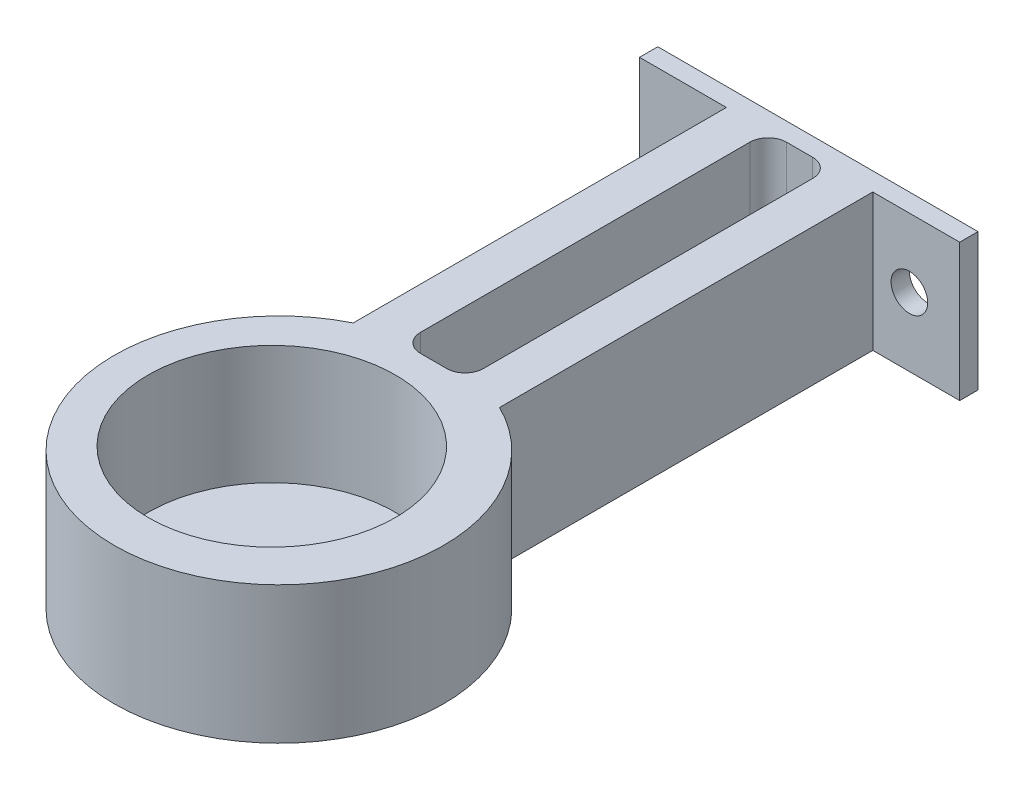
ISO-10303-21;
HEADER;
FILE_DESCRIPTION(('STEP AP214'),'2;1');
FILE_NAME('part.step','',(''),(''),'','','');
FILE_SCHEMA(('AUTOMOTIVE_DESIGN { 1 0 10303 214 1 1 1 1 }'));
ENDSEC;
DATA;
#1=APPLICATION_CONTEXT('core data for automotive mechanical design processes');
#2=APPLICATION_PROTOCOL_DEFINITION('international standard','automotive_design',2000,#1);
#3=PRODUCT_CONTEXT('',#1,'mechanical');
#4=PRODUCT('Part','Part','',(#3));
#5=PRODUCT_RELATED_PRODUCT_CATEGORY('part','',(#4));
#6=PRODUCT_DEFINITION_FORMATION('','',#4);
#7=PRODUCT_DEFINITION_CONTEXT('part definition',#1,'design');
#8=PRODUCT_DEFINITION('design','',#6,#7);
#9=PRODUCT_DEFINITION_SHAPE('','',#8);
#10=(LENGTH_UNIT() NAMED_UNIT(*) SI_UNIT(.MILLI.,.METRE.));
#11=(NAMED_UNIT(*) PLANE_ANGLE_UNIT() SI_UNIT($,.RADIAN.));
#12=(NAMED_UNIT(*) SI_UNIT($,.STERADIAN.) SOLID_ANGLE_UNIT());
#13=UNCERTAINTY_MEASURE_WITH_UNIT(LENGTH_MEASURE(1.E-05),#10,'distance_accuracy_value','');
#14=(GEOMETRIC_REPRESENTATION_CONTEXT(3) GLOBAL_UNCERTAINTY_ASSIGNED_CONTEXT((#13)) GLOBAL_UNIT_ASSIGNED_CONTEXT((#10,
#11,#12)) REPRESENTATION_CONTEXT('',''));
#15=CARTESIAN_POINT('',(0.,0.,0.));
#16=DIRECTION('',(0.,0.,1.));
#17=DIRECTION('',(1.,0.,0.));
#18=AXIS2_PLACEMENT_3D('',#15,#16,#17);
#19=CARTESIAN_POINT('',(6.14884425387227,15.,-16.9172017290574));
#20=DIRECTION('',(0.,0.,1.));
#21=DIRECTION('',(1.,0.,0.));
#22=AXIS2_PLACEMENT_3D('',#19,#20,#21);
#23=PLANE('',#22);
#24=DIRECTION('',(-1.,0.,0.));
#25=VECTOR('',#24,1.);
#26=CARTESIAN_POINT('',(6.14884425387227,15.,-16.9172017290574));
#27=LINE('',#26,#25);
#28=CARTESIAN_POINT('',(1.43477103108826,15.,-16.9172017290574));
#29=VERTEX_POINT('',#28);
#30=CARTESIAN_POINT('',(-1.43477103108824,15.,-16.9172017290574));
#31=VERTEX_POINT('',#30);
#32=EDGE_CURVE('E220',#29,#31,#27,.T.);
#33=ORIENTED_EDGE('',*,*,#32,.F.);
#34=DIRECTION('',(0.,1.,0.));
#35=VECTOR('',#34,1.);
#36=CARTESIAN_POINT('',(1.43477103108826,0.,-16.9172017290574));
#37=LINE('',#36,#35);
#38=CARTESIAN_POINT('',(1.43477103108826,0.,-16.9172017290574));
#39=VERTEX_POINT('',#38);
#40=EDGE_CURVE('E234',#29,#39,#37,.F.);
#41=ORIENTED_EDGE('',*,*,#40,.T.);
#42=DIRECTION('',(-1.,0.,0.));
#43=VECTOR('',#42,1.);
#44=CARTESIAN_POINT('',(6.14884425387227,0.,-16.9172017290574));
#45=LINE('',#44,#43);
#46=CARTESIAN_POINT('',(-1.43477103108824,0.,-16.9172017290574));
#47=VERTEX_POINT('',#46);
#48=EDGE_CURVE('E221',#39,#47,#45,.T.);
#49=ORIENTED_EDGE('',*,*,#48,.T.);
#50=DIRECTION('',(0.,1.,0.));
#51=VECTOR('',#50,1.);
#52=CARTESIAN_POINT('',(-1.43477103108825,15.,-16.9172017290574));
#53=LINE('',#52,#51);
#54=EDGE_CURVE('E231',#47,#31,#53,.T.);
#55=ORIENTED_EDGE('',*,*,#54,.T.);
#56=EDGE_LOOP('',(#33,#41,#49,#55));
#57=FACE_BOUND('',#56,.T.);
#58=ADVANCED_FACE('F39',(#57),#23,.F.);
#59=CARTESIAN_POINT('',(0.,15.,0.));
#60=DIRECTION('',(0.,-1.,0.));
#61=DIRECTION('',(0.,0.,-1.));
#62=AXIS2_PLACEMENT_3D('',#59,#60,#61);
#63=CYLINDRICAL_SURFACE('',#62,18.);
#64=DIRECTION('',(0.,-1.,0.));
#65=VECTOR('',#64,1.);
#66=CARTESIAN_POINT('',(8.,15.,-16.1245154965971));
#67=LINE('',#66,#65);
#68=CARTESIAN_POINT('',(8.,15.,-16.1245154965971));
#69=VERTEX_POINT('',#68);
#70=CARTESIAN_POINT('',(8.,0.,-16.1245154965971));
#71=VERTEX_POINT('',#70);
#72=EDGE_CURVE('E215',#69,#71,#67,.T.);
#73=ORIENTED_EDGE('',*,*,#72,.F.);
#74=CARTESIAN_POINT('',(0.,15.,0.));
#75=DIRECTION('',(0.,1.,0.));
#76=DIRECTION('',(0.,0.,1.));
#77=AXIS2_PLACEMENT_3D('',#74,#75,#76);
#78=CIRCLE('',#77,18.);
#79=CARTESIAN_POINT('',(-8.,15.,-16.1245154965971));
#80=VERTEX_POINT('',#79);
#81=EDGE_CURVE('E218',#80,#69,#78,.T.);
#82=ORIENTED_EDGE('',*,*,#81,.F.);
#83=DIRECTION('',(0.,-1.,0.));
#84=VECTOR('',#83,1.);
#85=CARTESIAN_POINT('',(-8.,15.,-16.1245154965971));
#86=LINE('',#85,#84);
#87=CARTESIAN_POINT('',(-8.,0.,-16.1245154965971));
#88=VERTEX_POINT('',#87);
#89=EDGE_CURVE('E207',#80,#88,#86,.T.);
#90=ORIENTED_EDGE('',*,*,#89,.T.);
#91=CARTESIAN_POINT('',(0.,0.,0.));
#92=DIRECTION('',(0.,1.,0.));
#93=DIRECTION('',(0.,0.,1.));
#94=AXIS2_PLACEMENT_3D('',#91,#92,#93);
#95=CIRCLE('',#94,18.);
#96=EDGE_CURVE('E217',#88,#71,#95,.T.);
#97=ORIENTED_EDGE('',*,*,#96,.T.);
#98=EDGE_LOOP('',(#73,#82,#90,#97));
#99=FACE_BOUND('',#98,.T.);
#100=ADVANCED_FACE('F310',(#99),#63,.T.);
#101=CARTESIAN_POINT('',(0.,15.,0.));
#102=DIRECTION('',(0.,1.,0.));
#103=DIRECTION('',(0.,0.,1.));
#104=AXIS2_PLACEMENT_3D('',#101,#102,#103);
#105=PLANE('',#104);
#106=DIRECTION('',(0.,0.,1.));
#107=VECTOR('',#106,1.);
#108=CARTESIAN_POINT('',(-3.43477103108825,15.,-56.9172017290574));
#109=LINE('',#108,#107);
#110=CARTESIAN_POINT('',(-3.43477103108825,15.,-54.9172017290574));
#111=VERTEX_POINT('',#110);
#112=CARTESIAN_POINT('',(-3.43477103108825,15.,-18.9172017290574));
#113=VERTEX_POINT('',#112);
#114=EDGE_CURVE('E194',#111,#113,#109,.T.);
#115=ORIENTED_EDGE('',*,*,#114,.F.);
#116=CARTESIAN_POINT('',(-1.43477103108825,15.,-54.9172017290574));
#117=DIRECTION('',(0.,1.,0.));
#118=DIRECTION('',(0.,0.,1.));
#119=AXIS2_PLACEMENT_3D('',#116,#117,#118);
#120=CIRCLE('',#119,2.);
#121=CARTESIAN_POINT('',(-1.43477103108825,15.,-56.9172017290574));
#122=VERTEX_POINT('',#121);
#123=EDGE_CURVE('E47',#111,#122,#120,.F.);
#124=ORIENTED_EDGE('',*,*,#123,.T.);
#125=DIRECTION('',(1.,0.,0.));
#126=VECTOR('',#125,1.);
#127=CARTESIAN_POINT('',(0.,15.,-56.9172017290574));
#128=LINE('',#127,#126);
#129=CARTESIAN_POINT('',(1.43477103108826,15.,-56.9172017290574));
#130=VERTEX_POINT('',#129);
#131=EDGE_CURVE('E266',#122,#130,#128,.T.);
#132=ORIENTED_EDGE('',*,*,#131,.T.);
#133=CARTESIAN_POINT('',(1.43477103108826,15.,-54.9172017290574));
#134=DIRECTION('',(0.,1.,0.));
#135=DIRECTION('',(0.,0.,1.));
#136=AXIS2_PLACEMENT_3D('',#133,#134,#135);
#137=CIRCLE('',#136,2.);
#138=CARTESIAN_POINT('',(3.43477103108826,15.,-54.9172017290574));
#139=VERTEX_POINT('',#138);
#140=EDGE_CURVE('E258',#130,#139,#137,.F.);
#141=ORIENTED_EDGE('',*,*,#140,.T.);
#142=DIRECTION('',(0.,0.,1.));
#143=VECTOR('',#142,1.);
#144=CARTESIAN_POINT('',(3.43477103108826,15.,-56.9172017290574));
#145=LINE('',#144,#143);
#146=CARTESIAN_POINT('',(3.43477103108826,15.,-18.9172017290574));
#147=VERTEX_POINT('',#146);
#148=EDGE_CURVE('E182',#139,#147,#145,.T.);
#149=ORIENTED_EDGE('',*,*,#148,.T.);
#150=CARTESIAN_POINT('',(1.43477103108826,15.,-18.9172017290574));
#151=DIRECTION('',(0.,1.,0.));
#152=DIRECTION('',(0.,0.,1.));
#153=AXIS2_PLACEMENT_3D('',#150,#151,#152);
#154=CIRCLE('',#153,2.);
#155=EDGE_CURVE('E239',#147,#29,#154,.F.);
#156=ORIENTED_EDGE('',*,*,#155,.T.);
#157=ORIENTED_EDGE('',*,*,#32,.T.);
#158=CARTESIAN_POINT('',(-1.43477103108825,15.,-18.9172017290574));
#159=DIRECTION('',(0.,1.,0.));
#160=DIRECTION('',(0.,0.,1.));
#161=AXIS2_PLACEMENT_3D('',#158,#159,#160);
#162=CIRCLE('',#161,2.);
#163=EDGE_CURVE('E244',#31,#113,#162,.F.);
#164=ORIENTED_EDGE('',*,*,#163,.T.);
#165=EDGE_LOOP('',(#115,#124,#132,#141,#149,#156,#157,#164));
#166=FACE_BOUND('',#165,.T.);
#167=CARTESIAN_POINT('',(-0.775740082247012,15.,0.));
#168=DIRECTION('',(0.,1.,0.));
#169=DIRECTION('',(0.,0.,1.));
#170=AXIS2_PLACEMENT_3D('',#167,#168,#169);
#171=CIRCLE('',#170,13.51);
#172=CARTESIAN_POINT('',(-0.775740082247012,15.,13.51));
#173=VERTEX_POINT('',#172);
#174=EDGE_CURVE('E198',#173,#173,#171,.T.);
#175=ORIENTED_EDGE('',*,*,#174,.F.);
#176=EDGE_LOOP('',(#175));
#177=FACE_BOUND('',#176,.T.);
#178=ORIENTED_EDGE('',*,*,#81,.T.);
#179=DIRECTION('',(0.,0.,-1.));
#180=VECTOR('',#179,1.);
#181=CARTESIAN_POINT('',(8.,15.,-12.9172017290574));
#182=LINE('',#181,#180);
#183=CARTESIAN_POINT('',(8.,15.,-56.9172017290574));
#184=VERTEX_POINT('',#183);
#185=EDGE_CURVE('E208',#69,#184,#182,.T.);
#186=ORIENTED_EDGE('',*,*,#185,.T.);
#187=CARTESIAN_POINT('',(17.5,15.,-56.9172017290574));
#188=VERTEX_POINT('',#187);
#189=EDGE_CURVE('E272',#184,#188,#128,.T.);
#190=ORIENTED_EDGE('',*,*,#189,.T.);
#191=DIRECTION('',(0.,0.,1.));
#192=VECTOR('',#191,1.);
#193=CARTESIAN_POINT('',(17.5,15.,-58.9172017290574));
#194=LINE('',#193,#192);
#195=CARTESIAN_POINT('',(17.5,15.,-58.9172017290574));
#196=VERTEX_POINT('',#195);
#197=EDGE_CURVE('E160',#196,#188,#194,.T.);
#198=ORIENTED_EDGE('',*,*,#197,.F.);
#199=DIRECTION('',(1.,0.,0.));
#200=VECTOR('',#199,1.);
#201=CARTESIAN_POINT('',(0.,15.,-58.9172017290574));
#202=LINE('',#201,#200);
#203=CARTESIAN_POINT('',(-17.5,15.,-58.9172017290574));
#204=VERTEX_POINT('',#203);
#205=EDGE_CURVE('E151',#204,#196,#202,.T.);
#206=ORIENTED_EDGE('',*,*,#205,.F.);
#207=DIRECTION('',(0.,0.,1.));
#208=VECTOR('',#207,1.);
#209=CARTESIAN_POINT('',(-17.5,15.,-58.9172017290574));
#210=LINE('',#209,#208);
#211=CARTESIAN_POINT('',(-17.5,15.,-56.9172017290574));
#212=VERTEX_POINT('',#211);
#213=EDGE_CURVE('E157',#204,#212,#210,.T.);
#214=ORIENTED_EDGE('',*,*,#213,.T.);
#215=CARTESIAN_POINT('',(-8.,15.,-56.9172017290574));
#216=VERTEX_POINT('',#215);
#217=EDGE_CURVE('E271',#212,#216,#128,.T.);
#218=ORIENTED_EDGE('',*,*,#217,.T.);
#219=DIRECTION('',(0.,0.,-1.));
#220=VECTOR('',#219,1.);
#221=CARTESIAN_POINT('',(-8.,15.,-12.9172017290574));
#222=LINE('',#221,#220);
#223=EDGE_CURVE('E210',#80,#216,#222,.T.);
#224=ORIENTED_EDGE('',*,*,#223,.F.);
#225=EDGE_LOOP('',(#178,#186,#190,#198,#206,#214,#218,#224));
#226=FACE_BOUND('',#225,.T.);
#227=ADVANCED_FACE('F154',(#166,#177,#226),#105,.T.);
#228=CARTESIAN_POINT('',(0.,0.,0.));
#229=DIRECTION('',(0.,1.,0.));
#230=DIRECTION('',(0.,0.,1.));
#231=AXIS2_PLACEMENT_3D('',#228,#229,#230);
#232=PLANE('',#231);
#233=DIRECTION('',(0.,0.,-1.));
#234=VECTOR('',#233,1.);
#235=CARTESIAN_POINT('',(-8.,0.,-12.9172017290574));
#236=LINE('',#235,#234);
#237=CARTESIAN_POINT('',(-8.,0.,-56.9172017290574));
#238=VERTEX_POINT('',#237);
#239=EDGE_CURVE('E202',#88,#238,#236,.T.);
#240=ORIENTED_EDGE('',*,*,#239,.T.);
#241=DIRECTION('',(1.,0.,0.));
#242=VECTOR('',#241,1.);
#243=CARTESIAN_POINT('',(0.,0.,-56.9172017290574));
#244=LINE('',#243,#242);
#245=CARTESIAN_POINT('',(-17.5,0.,-56.9172017290574));
#246=VERTEX_POINT('',#245);
#247=EDGE_CURVE('E362',#246,#238,#244,.T.);
#248=ORIENTED_EDGE('',*,*,#247,.F.);
#249=DIRECTION('',(0.,0.,1.));
#250=VECTOR('',#249,1.);
#251=CARTESIAN_POINT('',(-17.5,0.,-58.9172017290574));
#252=LINE('',#251,#250);
#253=CARTESIAN_POINT('',(-17.5,0.,-58.9172017290574));
#254=VERTEX_POINT('',#253);
#255=EDGE_CURVE('E371',#254,#246,#252,.T.);
#256=ORIENTED_EDGE('',*,*,#255,.F.);
#257=DIRECTION('',(1.,0.,0.));
#258=VECTOR('',#257,1.);
#259=CARTESIAN_POINT('',(0.,0.,-58.9172017290574));
#260=LINE('',#259,#258);
#261=CARTESIAN_POINT('',(17.5,0.,-58.9172017290574));
#262=VERTEX_POINT('',#261);
#263=EDGE_CURVE('E172',#254,#262,#260,.T.);
#264=ORIENTED_EDGE('',*,*,#263,.T.);
#265=DIRECTION('',(0.,0.,1.));
#266=VECTOR('',#265,1.);
#267=CARTESIAN_POINT('',(17.5,0.,-58.9172017290574));
#268=LINE('',#267,#266);
#269=CARTESIAN_POINT('',(17.5,0.,-56.9172017290574));
#270=VERTEX_POINT('',#269);
#271=EDGE_CURVE('E184',#262,#270,#268,.T.);
#272=ORIENTED_EDGE('',*,*,#271,.T.);
#273=CARTESIAN_POINT('',(8.,0.,-56.9172017290574));
#274=VERTEX_POINT('',#273);
#275=EDGE_CURVE('E368',#274,#270,#244,.T.);
#276=ORIENTED_EDGE('',*,*,#275,.F.);
#277=DIRECTION('',(0.,0.,-1.));
#278=VECTOR('',#277,1.);
#279=CARTESIAN_POINT('',(8.,0.,-12.9172017290574));
#280=LINE('',#279,#278);
#281=EDGE_CURVE('E205',#71,#274,#280,.T.);
#282=ORIENTED_EDGE('',*,*,#281,.F.);
#283=ORIENTED_EDGE('',*,*,#96,.F.);
#284=EDGE_LOOP('',(#240,#248,#256,#264,#272,#276,#282,#283));
#285=FACE_BOUND('',#284,.T.);
#286=ORIENTED_EDGE('',*,*,#48,.F.);
#287=CARTESIAN_POINT('',(1.43477103108826,0.,-18.9172017290574));
#288=DIRECTION('',(0.,1.,0.));
#289=DIRECTION('',(0.,0.,1.));
#290=AXIS2_PLACEMENT_3D('',#287,#288,#289);
#291=CIRCLE('',#290,2.);
#292=CARTESIAN_POINT('',(3.43477103108826,0.,-18.9172017290574));
#293=VERTEX_POINT('',#292);
#294=EDGE_CURVE('E241',#39,#293,#291,.T.);
#295=ORIENTED_EDGE('',*,*,#294,.T.);
#296=DIRECTION('',(0.,0.,1.));
#297=VECTOR('',#296,1.);
#298=CARTESIAN_POINT('',(3.43477103108826,0.,-56.9172017290574));
#299=LINE('',#298,#297);
#300=CARTESIAN_POINT('',(3.43477103108826,0.,-54.9172017290574));
#301=VERTEX_POINT('',#300);
#302=EDGE_CURVE('E189',#301,#293,#299,.T.);
#303=ORIENTED_EDGE('',*,*,#302,.F.);
#304=CARTESIAN_POINT('',(1.43477103108826,0.,-54.9172017290574));
#305=DIRECTION('',(0.,1.,0.));
#306=DIRECTION('',(0.,0.,1.));
#307=AXIS2_PLACEMENT_3D('',#304,#305,#306);
#308=CIRCLE('',#307,2.);
#309=CARTESIAN_POINT('',(1.43477103108826,0.,-56.9172017290574));
#310=VERTEX_POINT('',#309);
#311=EDGE_CURVE('E260',#301,#310,#308,.T.);
#312=ORIENTED_EDGE('',*,*,#311,.T.);
#313=CARTESIAN_POINT('',(-1.43477103108825,0.,-56.9172017290574));
#314=VERTEX_POINT('',#313);
#315=EDGE_CURVE('E366',#314,#310,#244,.T.);
#316=ORIENTED_EDGE('',*,*,#315,.F.);
#317=CARTESIAN_POINT('',(-1.43477103108825,0.,-54.9172017290574));
#318=DIRECTION('',(0.,1.,0.));
#319=DIRECTION('',(0.,0.,1.));
#320=AXIS2_PLACEMENT_3D('',#317,#318,#319);
#321=CIRCLE('',#320,2.);
#322=CARTESIAN_POINT('',(-3.43477103108825,0.,-54.9172017290574));
#323=VERTEX_POINT('',#322);
#324=EDGE_CURVE('E11',#314,#323,#321,.T.);
#325=ORIENTED_EDGE('',*,*,#324,.T.);
#326=DIRECTION('',(0.,0.,1.));
#327=VECTOR('',#326,1.);
#328=CARTESIAN_POINT('',(-3.43477103108825,0.,-56.9172017290574));
#329=LINE('',#328,#327);
#330=CARTESIAN_POINT('',(-3.43477103108825,0.,-18.9172017290574));
#331=VERTEX_POINT('',#330);
#332=EDGE_CURVE('E196',#323,#331,#329,.T.);
#333=ORIENTED_EDGE('',*,*,#332,.T.);
#334=CARTESIAN_POINT('',(-1.43477103108825,0.,-18.9172017290574));
#335=DIRECTION('',(0.,1.,0.));
#336=DIRECTION('',(0.,0.,1.));
#337=AXIS2_PLACEMENT_3D('',#334,#335,#336);
#338=CIRCLE('',#337,2.);
#339=EDGE_CURVE('E247',#331,#47,#338,.T.);
#340=ORIENTED_EDGE('',*,*,#339,.T.);
#341=EDGE_LOOP('',(#286,#295,#303,#312,#316,#325,#333,#340));
#342=FACE_BOUND('',#341,.T.);
#343=ADVANCED_FACE('F279',(#285,#342),#232,.F.);
#344=CARTESIAN_POINT('',(-8.,0.,-12.9172017290574));
#345=DIRECTION('',(-1.,0.,0.));
#346=DIRECTION('',(0.,0.,1.));
#347=AXIS2_PLACEMENT_3D('',#344,#345,#346);
#348=PLANE('',#347);
#349=ORIENTED_EDGE('',*,*,#89,.F.);
#350=ORIENTED_EDGE('',*,*,#223,.T.);
#351=DIRECTION('',(0.,1.,0.));
#352=VECTOR('',#351,1.);
#353=CARTESIAN_POINT('',(-8.,0.,-56.9172017290574));
#354=LINE('',#353,#352);
#355=EDGE_CURVE('E191',#238,#216,#354,.T.);
#356=ORIENTED_EDGE('',*,*,#355,.F.);
#357=ORIENTED_EDGE('',*,*,#239,.F.);
#358=EDGE_LOOP('',(#349,#350,#356,#357));
#359=FACE_BOUND('',#358,.T.);
#360=ADVANCED_FACE('F404',(#359),#348,.T.);
#361=CARTESIAN_POINT('',(8.,0.,-12.9172017290574));
#362=DIRECTION('',(-1.,0.,0.));
#363=DIRECTION('',(0.,0.,1.));
#364=AXIS2_PLACEMENT_3D('',#361,#362,#363);
#365=PLANE('',#364);
#366=ORIENTED_EDGE('',*,*,#185,.F.);
#367=ORIENTED_EDGE('',*,*,#72,.T.);
#368=ORIENTED_EDGE('',*,*,#281,.T.);
#369=DIRECTION('',(0.,-1.,0.));
#370=VECTOR('',#369,1.);
#371=CARTESIAN_POINT('',(8.,0.,-56.9172017290574));
#372=LINE('',#371,#370);
#373=EDGE_CURVE('E179',#184,#274,#372,.T.);
#374=ORIENTED_EDGE('',*,*,#373,.F.);
#375=EDGE_LOOP('',(#366,#367,#368,#374));
#376=FACE_BOUND('',#375,.T.);
#377=ADVANCED_FACE('F399',(#376),#365,.F.);
#378=CARTESIAN_POINT('',(-0.775740082247012,2.,0.));
#379=DIRECTION('',(0.,1.,0.));
#380=DIRECTION('',(0.,0.,1.));
#381=AXIS2_PLACEMENT_3D('',#378,#379,#380);
#382=CYLINDRICAL_SURFACE('',#381,13.51);
#383=CARTESIAN_POINT('',(-0.775740082247012,2.,0.));
#384=DIRECTION('',(0.,1.,0.));
#385=DIRECTION('',(0.,0.,1.));
#386=AXIS2_PLACEMENT_3D('',#383,#384,#385);
#387=CIRCLE('',#386,13.51);
#388=CARTESIAN_POINT('',(-0.775740082247012,2.,13.51));
#389=VERTEX_POINT('',#388);
#390=EDGE_CURVE('E199',#389,#389,#387,.T.);
#391=CARTESIAN_POINT('',(-0.775740082247012,2.,13.51));
#392=CARTESIAN_POINT('',(-0.775740082247012,2.13541666666667,13.51));
#393=CARTESIAN_POINT('',(-0.775740082247012,2.27083333333333,13.51));
#394=CARTESIAN_POINT('',(-0.775740082247012,2.54166666666667,13.51));
#395=CARTESIAN_POINT('',(-0.775740082247012,2.67708333333333,13.51));
#396=CARTESIAN_POINT('',(-0.775740082247012,2.94791666666667,13.51));
#397=CARTESIAN_POINT('',(-0.775740082247012,3.08333333333333,13.51));
#398=CARTESIAN_POINT('',(-0.775740082247012,3.35416666666667,13.51));
#399=CARTESIAN_POINT('',(-0.775740082247012,3.48958333333333,13.51));
#400=CARTESIAN_POINT('',(-0.775740082247012,3.76041666666667,13.51));
#401=CARTESIAN_POINT('',(-0.775740082247012,3.89583333333333,13.51));
#402=CARTESIAN_POINT('',(-0.775740082247012,4.16666666666667,13.51));
#403=CARTESIAN_POINT('',(-0.775740082247012,4.30208333333333,13.51));
#404=CARTESIAN_POINT('',(-0.775740082247012,4.57291666666667,13.51));
#405=CARTESIAN_POINT('',(-0.775740082247012,4.70833333333333,13.51));
#406=CARTESIAN_POINT('',(-0.775740082247012,4.97916666666667,13.51));
#407=CARTESIAN_POINT('',(-0.775740082247012,5.11458333333333,13.51));
#408=CARTESIAN_POINT('',(-0.775740082247012,5.38541666666667,13.51));
#409=CARTESIAN_POINT('',(-0.775740082247012,5.52083333333333,13.51));
#410=CARTESIAN_POINT('',(-0.775740082247012,5.79166666666667,13.51));
#411=CARTESIAN_POINT('',(-0.775740082247012,5.92708333333333,13.51));
#412=CARTESIAN_POINT('',(-0.775740082247012,6.19791666666667,13.51));
#413=CARTESIAN_POINT('',(-0.775740082247012,6.33333333333333,13.51));
#414=CARTESIAN_POINT('',(-0.775740082247012,6.60416666666667,13.51));
#415=CARTESIAN_POINT('',(-0.775740082247012,6.73958333333333,13.51));
#416=CARTESIAN_POINT('',(-0.775740082247012,7.01041666666667,13.51));
#417=CARTESIAN_POINT('',(-0.775740082247012,7.14583333333333,13.51));
#418=CARTESIAN_POINT('',(-0.775740082247012,7.41666666666667,13.51));
#419=CARTESIAN_POINT('',(-0.775740082247012,7.55208333333333,13.51));
#420=CARTESIAN_POINT('',(-0.775740082247012,7.82291666666667,13.51));
#421=CARTESIAN_POINT('',(-0.775740082247012,7.95833333333333,13.51));
#422=CARTESIAN_POINT('',(-0.775740082247012,8.22916666666667,13.51));
#423=CARTESIAN_POINT('',(-0.775740082247012,8.36458333333333,13.51));
#424=CARTESIAN_POINT('',(-0.775740082247012,8.63541666666667,13.51));
#425=CARTESIAN_POINT('',(-0.775740082247012,8.77083333333333,13.51));
#426=CARTESIAN_POINT('',(-0.775740082247012,9.04166666666667,13.51));
#427=CARTESIAN_POINT('',(-0.775740082247012,9.17708333333333,13.51));
#428=CARTESIAN_POINT('',(-0.775740082247012,9.44791666666667,13.51));
#429=CARTESIAN_POINT('',(-0.775740082247012,9.58333333333333,13.51));
#430=CARTESIAN_POINT('',(-0.775740082247012,9.85416666666667,13.51));
#431=CARTESIAN_POINT('',(-0.775740082247012,9.98958333333333,13.51));
#432=CARTESIAN_POINT('',(-0.775740082247012,10.2604166666667,13.51));
#433=CARTESIAN_POINT('',(-0.775740082247012,10.3958333333333,13.51));
#434=CARTESIAN_POINT('',(-0.775740082247012,10.6666666666667,13.51));
#435=CARTESIAN_POINT('',(-0.775740082247012,10.8020833333333,13.51));
#436=CARTESIAN_POINT('',(-0.775740082247012,11.0729166666667,13.51));
#437=CARTESIAN_POINT('',(-0.775740082247012,11.2083333333333,13.51));
#438=CARTESIAN_POINT('',(-0.775740082247012,11.4791666666667,13.51));
#439=CARTESIAN_POINT('',(-0.775740082247012,11.6145833333333,13.51));
#440=CARTESIAN_POINT('',(-0.775740082247012,11.8854166666667,13.51));
#441=CARTESIAN_POINT('',(-0.775740082247012,12.0208333333333,13.51));
#442=CARTESIAN_POINT('',(-0.775740082247012,12.2916666666667,13.51));
#443=CARTESIAN_POINT('',(-0.775740082247012,12.4270833333333,13.51));
#444=CARTESIAN_POINT('',(-0.775740082247012,12.6979166666667,13.51));
#445=CARTESIAN_POINT('',(-0.775740082247012,12.8333333333333,13.51));
#446=CARTESIAN_POINT('',(-0.775740082247012,13.1041666666667,13.51));
#447=CARTESIAN_POINT('',(-0.775740082247012,13.2395833333333,13.51));
#448=CARTESIAN_POINT('',(-0.775740082247012,13.5104166666667,13.51));
#449=CARTESIAN_POINT('',(-0.775740082247012,13.6458333333333,13.51));
#450=CARTESIAN_POINT('',(-0.775740082247012,13.9166666666667,13.51));
#451=CARTESIAN_POINT('',(-0.775740082247012,14.0520833333333,13.51));
#452=CARTESIAN_POINT('',(-0.775740082247012,14.3229166666667,13.51));
#453=CARTESIAN_POINT('',(-0.775740082247012,14.4583333333333,13.51));
#454=CARTESIAN_POINT('',(-0.775740082247012,14.7291666666667,13.51));
#455=CARTESIAN_POINT('',(-0.775740082247012,14.8645833333333,13.51));
#456=CARTESIAN_POINT('',(-0.775740082247012,15.,13.51));
#457=B_SPLINE_CURVE_WITH_KNOTS('',3,(#391,#392,#393,#394,#395,#396,#397,#398,#399,#400,#401,
#402,#403,#404,#405,#406,#407,#408,#409,#410,#411,#412,#413,#414,#415,#416,#417,#418,#419,#420,
#421,#422,#423,#424,#425,#426,#427,#428,#429,#430,#431,#432,#433,#434,#435,#436,#437,#438,#439,
#440,#441,#442,#443,#444,#445,#446,#447,#448,#449,#450,#451,#452,#453,#454,#455,#456),
.UNSPECIFIED.,.F.,.F.,(4,2,2,2,2,2,2,2,2,2,2,2,2,2,2,2,2,2,2,2,2,2,2,2,2,2,2,2,2,2,2,2,4),(0.,
0.40625,0.8125,1.21875,1.625,2.03125,2.4375,2.84375,3.25,3.65625,4.0625,4.46875,4.875,5.28125,
5.6875,6.09375,6.5,6.90625,7.3125,7.71875,8.125,8.53125,8.9375,9.34375,9.75,10.15625,10.5625,
10.96875,11.375,11.78125,12.1875,12.59375,13.),.UNSPECIFIED.);
#458=EDGE_CURVE('BSEAM412',#389,#173,#457,.T.);
#459=ORIENTED_EDGE('',*,*,#390,.F.);
#460=ORIENTED_EDGE('',*,*,#174,.T.);
#461=ORIENTED_EDGE('',*,*,#458,.T.);
#462=ORIENTED_EDGE('',*,*,#458,.F.);
#463=EDGE_LOOP('',(#459,#461,#460,#462));
#464=FACE_BOUND('',#463,.T.);
#465=ADVANCED_FACE('F412',(#464),#382,.F.);
#466=CARTESIAN_POINT('',(-0.775740082247012,2.,0.));
#467=DIRECTION('',(0.,1.,0.));
#468=DIRECTION('',(0.,0.,1.));
#469=AXIS2_PLACEMENT_3D('',#466,#467,#468);
#470=PLANE('',#469);
#471=ORIENTED_EDGE('',*,*,#390,.T.);
#472=EDGE_LOOP('',(#471));
#473=FACE_BOUND('',#472,.T.);
#474=ADVANCED_FACE('F306',(#473),#470,.T.);
#475=CARTESIAN_POINT('',(-3.43477103108825,0.,-56.9172017290574));
#476=DIRECTION('',(1.,0.,0.));
#477=DIRECTION('',(0.,0.,-1.));
#478=AXIS2_PLACEMENT_3D('',#475,#476,#477);
#479=PLANE('',#478);
#480=ORIENTED_EDGE('',*,*,#332,.F.);
#481=DIRECTION('',(0.,1.,0.));
#482=VECTOR('',#481,1.);
#483=CARTESIAN_POINT('',(-3.43477103108825,0.,-54.9172017290574));
#484=LINE('',#483,#482);
#485=EDGE_CURVE('E256',#323,#111,#484,.T.);
#486=ORIENTED_EDGE('',*,*,#485,.T.);
#487=ORIENTED_EDGE('',*,*,#114,.T.);
#488=DIRECTION('',(0.,1.,0.));
#489=VECTOR('',#488,1.);
#490=CARTESIAN_POINT('',(-3.43477103108825,0.,-18.9172017290574));
#491=LINE('',#490,#489);
#492=EDGE_CURVE('E236',#113,#331,#491,.F.);
#493=ORIENTED_EDGE('',*,*,#492,.T.);
#494=EDGE_LOOP('',(#480,#486,#487,#493));
#495=FACE_BOUND('',#494,.T.);
#496=ADVANCED_FACE('F275',(#495),#479,.T.);
#497=CARTESIAN_POINT('',(3.43477103108826,0.,-56.9172017290574));
#498=DIRECTION('',(1.,0.,0.));
#499=DIRECTION('',(0.,0.,-1.));
#500=AXIS2_PLACEMENT_3D('',#497,#498,#499);
#501=PLANE('',#500);
#502=ORIENTED_EDGE('',*,*,#148,.F.);
#503=DIRECTION('',(0.,1.,0.));
#504=VECTOR('',#503,1.);
#505=CARTESIAN_POINT('',(3.43477103108826,0.,-54.9172017290574));
#506=LINE('',#505,#504);
#507=EDGE_CURVE('E254',#139,#301,#506,.F.);
#508=ORIENTED_EDGE('',*,*,#507,.T.);
#509=ORIENTED_EDGE('',*,*,#302,.T.);
#510=DIRECTION('',(0.,1.,0.));
#511=VECTOR('',#510,1.);
#512=CARTESIAN_POINT('',(3.43477103108826,15.,-18.9172017290574));
#513=LINE('',#512,#511);
#514=EDGE_CURVE('E224',#293,#147,#513,.T.);
#515=ORIENTED_EDGE('',*,*,#514,.T.);
#516=EDGE_LOOP('',(#502,#508,#509,#515));
#517=FACE_BOUND('',#516,.T.);
#518=ADVANCED_FACE('F298',(#517),#501,.F.);
#519=CARTESIAN_POINT('',(1.43477103108826,0.,-18.9172017290574));
#520=DIRECTION('',(0.,-1.,0.));
#521=DIRECTION('',(0.,0.,-1.));
#522=AXIS2_PLACEMENT_3D('',#519,#520,#521);
#523=CYLINDRICAL_SURFACE('',#522,2.);
#524=ORIENTED_EDGE('',*,*,#294,.F.);
#525=ORIENTED_EDGE('',*,*,#40,.F.);
#526=ORIENTED_EDGE('',*,*,#155,.F.);
#527=ORIENTED_EDGE('',*,*,#514,.F.);
#528=EDGE_LOOP('',(#524,#525,#526,#527));
#529=FACE_BOUND('',#528,.T.);
#530=ADVANCED_FACE('F289',(#529),#523,.F.);
#531=CARTESIAN_POINT('',(-1.43477103108825,15.,-18.9172017290574));
#532=DIRECTION('',(0.,1.,0.));
#533=DIRECTION('',(0.,0.,1.));
#534=AXIS2_PLACEMENT_3D('',#531,#532,#533);
#535=CYLINDRICAL_SURFACE('',#534,2.);
#536=ORIENTED_EDGE('',*,*,#339,.F.);
#537=ORIENTED_EDGE('',*,*,#492,.F.);
#538=ORIENTED_EDGE('',*,*,#163,.F.);
#539=ORIENTED_EDGE('',*,*,#54,.F.);
#540=EDGE_LOOP('',(#536,#537,#538,#539));
#541=FACE_BOUND('',#540,.T.);
#542=ADVANCED_FACE('F286',(#541),#535,.F.);
#543=CARTESIAN_POINT('',(0.,0.,-56.9172017290574));
#544=DIRECTION('',(0.,0.,-1.));
#545=DIRECTION('',(-1.,0.,0.));
#546=AXIS2_PLACEMENT_3D('',#543,#544,#545);
#547=PLANE('',#546);
#548=CARTESIAN_POINT('',(12.,7.5,-56.9172017290574));
#549=DIRECTION('',(0.,0.,-1.));
#550=DIRECTION('',(-1.,0.,0.));
#551=AXIS2_PLACEMENT_3D('',#548,#549,#550);
#552=CIRCLE('',#551,2.);
#553=CARTESIAN_POINT('',(10.,7.5,-56.9172017290574));
#554=VERTEX_POINT('',#553);
#555=EDGE_CURVE('E174',#554,#554,#552,.T.);
#556=ORIENTED_EDGE('',*,*,#555,.T.);
#557=EDGE_LOOP('',(#556));
#558=FACE_BOUND('',#557,.T.);
#559=ORIENTED_EDGE('',*,*,#189,.F.);
#560=ORIENTED_EDGE('',*,*,#373,.T.);
#561=ORIENTED_EDGE('',*,*,#275,.T.);
#562=DIRECTION('',(0.,1.,0.));
#563=VECTOR('',#562,1.);
#564=CARTESIAN_POINT('',(17.5,0.,-56.9172017290574));
#565=LINE('',#564,#563);
#566=EDGE_CURVE('E379',#270,#188,#565,.T.);
#567=ORIENTED_EDGE('',*,*,#566,.T.);
#568=EDGE_LOOP('',(#559,#560,#561,#567));
#569=FACE_BOUND('',#568,.T.);
#570=ADVANCED_FACE('F321',(#558,#569),#547,.F.);
#571=ORIENTED_EDGE('',*,*,#355,.T.);
#572=ORIENTED_EDGE('',*,*,#217,.F.);
#573=DIRECTION('',(0.,1.,0.));
#574=VECTOR('',#573,1.);
#575=CARTESIAN_POINT('',(-17.5,0.,-56.9172017290574));
#576=LINE('',#575,#574);
#577=EDGE_CURVE('E178',#246,#212,#576,.T.);
#578=ORIENTED_EDGE('',*,*,#577,.F.);
#579=ORIENTED_EDGE('',*,*,#247,.T.);
#580=EDGE_LOOP('',(#571,#572,#578,#579));
#581=FACE_BOUND('',#580,.T.);
#582=CARTESIAN_POINT('',(-12.,7.49999999999999,-56.9172017290574));
#583=DIRECTION('',(0.,0.,-1.));
#584=DIRECTION('',(-1.,0.,0.));
#585=AXIS2_PLACEMENT_3D('',#582,#583,#584);
#586=CIRCLE('',#585,2.);
#587=CARTESIAN_POINT('',(-14.,7.49999999999999,-56.9172017290574));
#588=VERTEX_POINT('',#587);
#589=EDGE_CURVE('E360',#588,#588,#586,.F.);
#590=ORIENTED_EDGE('',*,*,#589,.F.);
#591=EDGE_LOOP('',(#590));
#592=FACE_BOUND('',#591,.T.);
#593=ADVANCED_FACE('F337',(#581,#592),#547,.F.);
#594=ORIENTED_EDGE('',*,*,#315,.T.);
#595=DIRECTION('',(0.,1.,0.));
#596=VECTOR('',#595,1.);
#597=CARTESIAN_POINT('',(1.43477103108826,15.,-56.9172017290574));
#598=LINE('',#597,#596);
#599=EDGE_CURVE('E251',#310,#130,#598,.T.);
#600=ORIENTED_EDGE('',*,*,#599,.T.);
#601=ORIENTED_EDGE('',*,*,#131,.F.);
#602=DIRECTION('',(0.,1.,0.));
#603=VECTOR('',#602,1.);
#604=CARTESIAN_POINT('',(-1.43477103108825,0.,-56.9172017290574));
#605=LINE('',#604,#603);
#606=EDGE_CURVE('E249',#122,#314,#605,.F.);
#607=ORIENTED_EDGE('',*,*,#606,.T.);
#608=EDGE_LOOP('',(#594,#600,#601,#607));
#609=FACE_BOUND('',#608,.T.);
#610=ADVANCED_FACE('F269',(#609),#547,.F.);
#611=CARTESIAN_POINT('',(-17.5,0.,-58.9172017290574));
#612=DIRECTION('',(1.,0.,0.));
#613=DIRECTION('',(0.,0.,-1.));
#614=AXIS2_PLACEMENT_3D('',#611,#612,#613);
#615=PLANE('',#614);
#616=ORIENTED_EDGE('',*,*,#577,.T.);
#617=ORIENTED_EDGE('',*,*,#213,.F.);
#618=DIRECTION('',(0.,1.,0.));
#619=VECTOR('',#618,1.);
#620=CARTESIAN_POINT('',(-17.5,0.,-58.9172017290574));
#621=LINE('',#620,#619);
#622=EDGE_CURVE('E165',#254,#204,#621,.T.);
#623=ORIENTED_EDGE('',*,*,#622,.F.);
#624=ORIENTED_EDGE('',*,*,#255,.T.);
#625=EDGE_LOOP('',(#616,#617,#623,#624));
#626=FACE_BOUND('',#625,.T.);
#627=ADVANCED_FACE('F176',(#626),#615,.F.);
#628=CARTESIAN_POINT('',(17.5,0.,-58.9172017290574));
#629=DIRECTION('',(1.,0.,0.));
#630=DIRECTION('',(0.,0.,-1.));
#631=AXIS2_PLACEMENT_3D('',#628,#629,#630);
#632=PLANE('',#631);
#633=ORIENTED_EDGE('',*,*,#566,.F.);
#634=ORIENTED_EDGE('',*,*,#271,.F.);
#635=DIRECTION('',(0.,1.,0.));
#636=VECTOR('',#635,1.);
#637=CARTESIAN_POINT('',(17.5,0.,-58.9172017290574));
#638=LINE('',#637,#636);
#639=EDGE_CURVE('E164',#262,#196,#638,.T.);
#640=ORIENTED_EDGE('',*,*,#639,.T.);
#641=ORIENTED_EDGE('',*,*,#197,.T.);
#642=EDGE_LOOP('',(#633,#634,#640,#641));
#643=FACE_BOUND('',#642,.T.);
#644=ADVANCED_FACE('F342',(#643),#632,.T.);
#645=CARTESIAN_POINT('',(-12.,7.49999999999999,-58.9172017290574));
#646=DIRECTION('',(0.,0.,1.));
#647=DIRECTION('',(1.,0.,0.));
#648=AXIS2_PLACEMENT_3D('',#645,#646,#647);
#649=CYLINDRICAL_SURFACE('',#648,2.);
#650=CARTESIAN_POINT('',(-12.,7.49999999999999,-58.9172017290574));
#651=DIRECTION('',(0.,0.,-1.));
#652=DIRECTION('',(-1.,0.,0.));
#653=AXIS2_PLACEMENT_3D('',#650,#651,#652);
#654=CIRCLE('',#653,2.);
#655=CARTESIAN_POINT('',(-14.,7.49999999999999,-58.9172017290574));
#656=VERTEX_POINT('',#655);
#657=EDGE_CURVE('E386',#656,#656,#654,.F.);
#658=ORIENTED_EDGE('',*,*,#657,.F.);
#659=EDGE_LOOP('',(#658));
#660=FACE_BOUND('',#659,.T.);
#661=ORIENTED_EDGE('',*,*,#589,.T.);
#662=EDGE_LOOP('',(#661));
#663=FACE_BOUND('',#662,.T.);
#664=ADVANCED_FACE('F332',(#660,#663),#649,.F.);
#665=CARTESIAN_POINT('',(12.,7.5,-58.9172017290574));
#666=DIRECTION('',(0.,0.,1.));
#667=DIRECTION('',(1.,0.,0.));
#668=AXIS2_PLACEMENT_3D('',#665,#666,#667);
#669=CYLINDRICAL_SURFACE('',#668,2.);
#670=CARTESIAN_POINT('',(12.,7.5,-58.9172017290574));
#671=DIRECTION('',(0.,0.,-1.));
#672=DIRECTION('',(-1.,0.,0.));
#673=AXIS2_PLACEMENT_3D('',#670,#671,#672);
#674=CIRCLE('',#673,2.);
#675=CARTESIAN_POINT('',(10.,7.5,-58.9172017290574));
#676=VERTEX_POINT('',#675);
#677=EDGE_CURVE('E372',#676,#676,#674,.T.);
#678=ORIENTED_EDGE('',*,*,#677,.T.);
#679=EDGE_LOOP('',(#678));
#680=FACE_BOUND('',#679,.T.);
#681=ORIENTED_EDGE('',*,*,#555,.F.);
#682=EDGE_LOOP('',(#681));
#683=FACE_BOUND('',#682,.T.);
#684=ADVANCED_FACE('F327',(#680,#683),#669,.F.);
#685=CARTESIAN_POINT('',(0.,0.,-58.9172017290574));
#686=DIRECTION('',(0.,0.,-1.));
#687=DIRECTION('',(-1.,0.,0.));
#688=AXIS2_PLACEMENT_3D('',#685,#686,#687);
#689=PLANE('',#688);
#690=ORIENTED_EDGE('',*,*,#622,.T.);
#691=ORIENTED_EDGE('',*,*,#205,.T.);
#692=ORIENTED_EDGE('',*,*,#639,.F.);
#693=ORIENTED_EDGE('',*,*,#263,.F.);
#694=EDGE_LOOP('',(#690,#691,#692,#693));
#695=FACE_BOUND('',#694,.T.);
#696=ORIENTED_EDGE('',*,*,#657,.T.);
#697=EDGE_LOOP('',(#696));
#698=FACE_BOUND('',#697,.T.);
#699=ORIENTED_EDGE('',*,*,#677,.F.);
#700=EDGE_LOOP('',(#699));
#701=FACE_BOUND('',#700,.T.);
#702=ADVANCED_FACE('F169',(#695,#698,#701),#689,.T.);
#703=CARTESIAN_POINT('',(1.43477103108826,0.,-54.9172017290574));
#704=DIRECTION('',(0.,-1.,0.));
#705=DIRECTION('',(0.,0.,-1.));
#706=AXIS2_PLACEMENT_3D('',#703,#704,#705);
#707=CYLINDRICAL_SURFACE('',#706,2.);
#708=ORIENTED_EDGE('',*,*,#311,.F.);
#709=ORIENTED_EDGE('',*,*,#507,.F.);
#710=ORIENTED_EDGE('',*,*,#140,.F.);
#711=ORIENTED_EDGE('',*,*,#599,.F.);
#712=EDGE_LOOP('',(#708,#709,#710,#711));
#713=FACE_BOUND('',#712,.T.);
#714=ADVANCED_FACE('F296',(#713),#707,.F.);
#715=CARTESIAN_POINT('',(-1.43477103108825,0.,-54.9172017290574));
#716=DIRECTION('',(0.,1.,0.));
#717=DIRECTION('',(0.,0.,1.));
#718=AXIS2_PLACEMENT_3D('',#715,#716,#717);
#719=CYLINDRICAL_SURFACE('',#718,2.);
#720=ORIENTED_EDGE('',*,*,#324,.F.);
#721=ORIENTED_EDGE('',*,*,#606,.F.);
#722=ORIENTED_EDGE('',*,*,#123,.F.);
#723=ORIENTED_EDGE('',*,*,#485,.F.);
#724=EDGE_LOOP('',(#720,#721,#722,#723));
#725=FACE_BOUND('',#724,.T.);
#726=ADVANCED_FACE('F41',(#725),#719,.F.);
#727=CLOSED_SHELL('',(#58,#100,#227,#343,#360,#377,#465,#474,#496,#518,#530,#542,#570,#593,#610,
#627,#644,#664,#684,#702,#714,#726));
#728=MANIFOLD_SOLID_BREP('B2',#727);
#729=ADVANCED_BREP_SHAPE_REPRESENTATION('',(#18,#728),#14);
#730=SHAPE_DEFINITION_REPRESENTATION(#9,#729);
ENDSEC;
END-ISO-10303-21;
